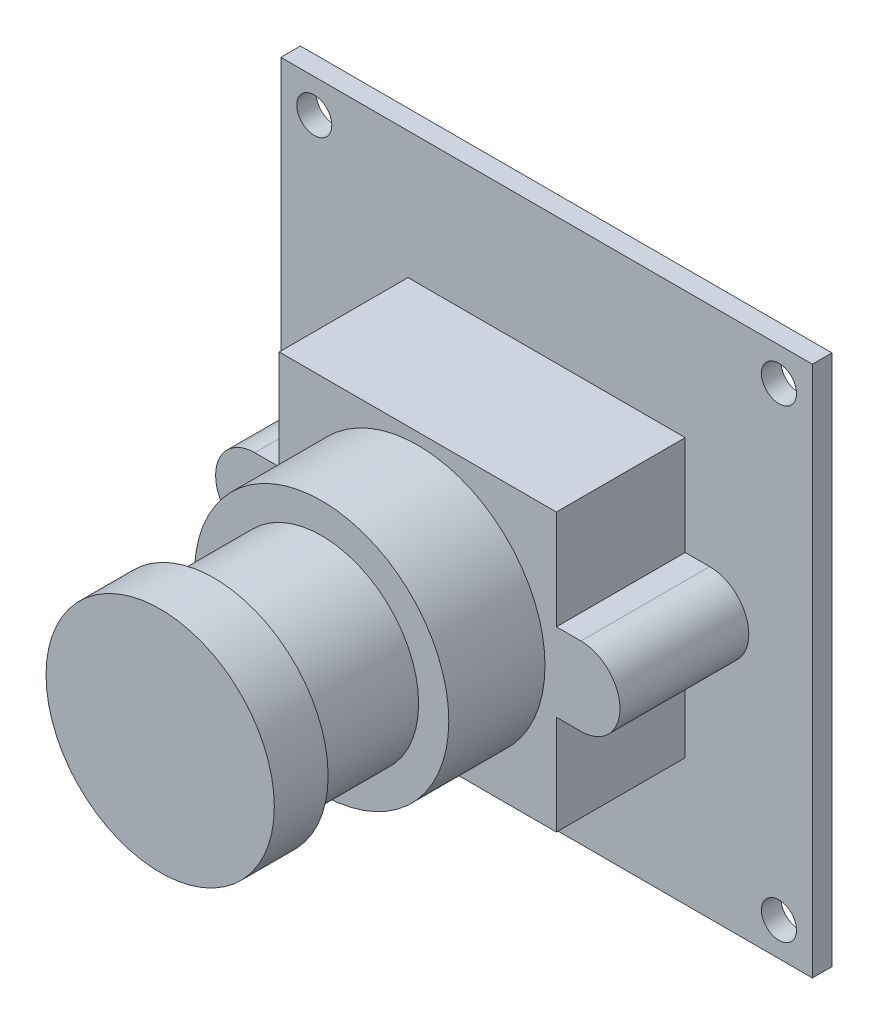
ISO-10303-21;
HEADER;
FILE_DESCRIPTION(('STEP AP214'),'2;1');
FILE_NAME('part.step','',(''),(''),'','','');
FILE_SCHEMA(('AUTOMOTIVE_DESIGN { 1 0 10303 214 1 1 1 1 }'));
ENDSEC;
DATA;
#1=APPLICATION_CONTEXT('core data for automotive mechanical design processes');
#2=APPLICATION_PROTOCOL_DEFINITION('international standard','automotive_design',2000,#1);
#3=PRODUCT_CONTEXT('',#1,'mechanical');
#4=PRODUCT('Part','Part','',(#3));
#5=PRODUCT_RELATED_PRODUCT_CATEGORY('part','',(#4));
#6=PRODUCT_DEFINITION_FORMATION('','',#4);
#7=PRODUCT_DEFINITION_CONTEXT('part definition',#1,'design');
#8=PRODUCT_DEFINITION('design','',#6,#7);
#9=PRODUCT_DEFINITION_SHAPE('','',#8);
#10=(LENGTH_UNIT() NAMED_UNIT(*) SI_UNIT(.MILLI.,.METRE.));
#11=(NAMED_UNIT(*) PLANE_ANGLE_UNIT() SI_UNIT($,.RADIAN.));
#12=(NAMED_UNIT(*) SI_UNIT($,.STERADIAN.) SOLID_ANGLE_UNIT());
#13=UNCERTAINTY_MEASURE_WITH_UNIT(LENGTH_MEASURE(1.E-05),#10,'distance_accuracy_value','');
#14=(GEOMETRIC_REPRESENTATION_CONTEXT(3) GLOBAL_UNCERTAINTY_ASSIGNED_CONTEXT((#13)) GLOBAL_UNIT_ASSIGNED_CONTEXT((#10,
#11,#12)) REPRESENTATION_CONTEXT('',''));
#15=CARTESIAN_POINT('',(0.,0.,0.));
#16=DIRECTION('',(0.,0.,1.));
#17=DIRECTION('',(1.,0.,0.));
#18=AXIS2_PLACEMENT_3D('',#15,#16,#17);
#19=CARTESIAN_POINT('',(0.,0.,15.));
#20=DIRECTION('',(0.,0.,1.));
#21=DIRECTION('',(1.,0.,0.));
#22=AXIS2_PLACEMENT_3D('',#19,#20,#21);
#23=PLANE('',#22);
#24=CARTESIAN_POINT('',(0.,0.,15.));
#25=DIRECTION('',(0.,0.,1.));
#26=DIRECTION('',(1.,0.,0.));
#27=AXIS2_PLACEMENT_3D('',#24,#25,#26);
#28=CIRCLE('',#27,7.8);
#29=CARTESIAN_POINT('',(7.8,0.,15.));
#30=VERTEX_POINT('',#29);
#31=EDGE_CURVE('E187',#30,#30,#28,.T.);
#32=ORIENTED_EDGE('',*,*,#31,.T.);
#33=EDGE_LOOP('',(#32));
#34=FACE_BOUND('',#33,.T.);
#35=CARTESIAN_POINT('',(0.,0.,15.));
#36=DIRECTION('',(0.,0.,1.));
#37=DIRECTION('',(1.,0.,0.));
#38=AXIS2_PLACEMENT_3D('',#35,#36,#37);
#39=CIRCLE('',#38,5.95);
#40=CARTESIAN_POINT('',(5.95,0.,15.));
#41=VERTEX_POINT('',#40);
#42=EDGE_CURVE('E605',#41,#41,#39,.T.);
#43=ORIENTED_EDGE('',*,*,#42,.F.);
#44=EDGE_LOOP('',(#43));
#45=FACE_BOUND('',#44,.T.);
#46=ADVANCED_FACE('F34',(#34,#45),#23,.T.);
#47=CARTESIAN_POINT('',(0.,0.,9.1));
#48=DIRECTION('',(0.,0.,1.));
#49=DIRECTION('',(1.,0.,0.));
#50=AXIS2_PLACEMENT_3D('',#47,#48,#49);
#51=PLANE('',#50);
#52=DIRECTION('',(0.,-1.,0.));
#53=VECTOR('',#52,1.);
#54=CARTESIAN_POINT('',(-8.5,8.5,9.1));
#55=LINE('',#54,#53);
#56=CARTESIAN_POINT('',(-8.5,8.5,9.1));
#57=VERTEX_POINT('',#56);
#58=CARTESIAN_POINT('',(-8.5,2.4,9.1));
#59=VERTEX_POINT('',#58);
#60=EDGE_CURVE('E201',#57,#59,#55,.T.);
#61=ORIENTED_EDGE('',*,*,#60,.T.);
#62=DIRECTION('',(-1.,0.,0.));
#63=VECTOR('',#62,1.);
#64=CARTESIAN_POINT('',(-10.,2.4,9.1));
#65=LINE('',#64,#63);
#66=CARTESIAN_POINT('',(-10.,2.4,9.1));
#67=VERTEX_POINT('',#66);
#68=EDGE_CURVE('E163',#59,#67,#65,.T.);
#69=ORIENTED_EDGE('',*,*,#68,.T.);
#70=CARTESIAN_POINT('',(-10.,0.,9.1));
#71=DIRECTION('',(0.,0.,1.));
#72=DIRECTION('',(1.,0.,0.));
#73=AXIS2_PLACEMENT_3D('',#70,#71,#72);
#74=CIRCLE('',#73,2.4);
#75=CARTESIAN_POINT('',(-10.,-2.4,9.1));
#76=VERTEX_POINT('',#75);
#77=EDGE_CURVE('E162',#67,#76,#74,.T.);
#78=ORIENTED_EDGE('',*,*,#77,.T.);
#79=DIRECTION('',(1.,0.,0.));
#80=VECTOR('',#79,1.);
#81=CARTESIAN_POINT('',(-10.,-2.4,9.1));
#82=LINE('',#81,#80);
#83=CARTESIAN_POINT('',(-8.5,-2.4,9.1));
#84=VERTEX_POINT('',#83);
#85=EDGE_CURVE('E49',#76,#84,#82,.T.);
#86=ORIENTED_EDGE('',*,*,#85,.T.);
#87=CARTESIAN_POINT('',(-8.5,-8.5,9.1));
#88=VERTEX_POINT('',#87);
#89=EDGE_CURVE('E200',#84,#88,#55,.T.);
#90=ORIENTED_EDGE('',*,*,#89,.T.);
#91=DIRECTION('',(1.,0.,0.));
#92=VECTOR('',#91,1.);
#93=CARTESIAN_POINT('',(-8.5,-8.5,9.1));
#94=LINE('',#93,#92);
#95=CARTESIAN_POINT('',(8.5,-8.5,9.1));
#96=VERTEX_POINT('',#95);
#97=EDGE_CURVE('E203',#88,#96,#94,.T.);
#98=ORIENTED_EDGE('',*,*,#97,.T.);
#99=DIRECTION('',(0.,1.,0.));
#100=VECTOR('',#99,1.);
#101=CARTESIAN_POINT('',(8.5,8.5,9.1));
#102=LINE('',#101,#100);
#103=CARTESIAN_POINT('',(8.5,-2.39999999999999,9.1));
#104=VERTEX_POINT('',#103);
#105=EDGE_CURVE('E195',#96,#104,#102,.T.);
#106=ORIENTED_EDGE('',*,*,#105,.T.);
#107=CARTESIAN_POINT('',(10.,-2.39999999999999,9.1));
#108=VERTEX_POINT('',#107);
#109=EDGE_CURVE('E169',#104,#108,#82,.T.);
#110=ORIENTED_EDGE('',*,*,#109,.T.);
#111=CARTESIAN_POINT('',(10.,0.,9.1));
#112=DIRECTION('',(0.,0.,1.));
#113=DIRECTION('',(1.,0.,0.));
#114=AXIS2_PLACEMENT_3D('',#111,#112,#113);
#115=CIRCLE('',#114,2.4);
#116=CARTESIAN_POINT('',(10.,2.40000000000001,9.1));
#117=VERTEX_POINT('',#116);
#118=EDGE_CURVE('E150',#108,#117,#115,.T.);
#119=ORIENTED_EDGE('',*,*,#118,.T.);
#120=CARTESIAN_POINT('',(8.5,2.40000000000001,9.1));
#121=VERTEX_POINT('',#120);
#122=EDGE_CURVE('E56',#117,#121,#65,.T.);
#123=ORIENTED_EDGE('',*,*,#122,.T.);
#124=CARTESIAN_POINT('',(8.5,8.5,9.1));
#125=VERTEX_POINT('',#124);
#126=EDGE_CURVE('E198',#121,#125,#102,.T.);
#127=ORIENTED_EDGE('',*,*,#126,.T.);
#128=DIRECTION('',(-1.,0.,0.));
#129=VECTOR('',#128,1.);
#130=CARTESIAN_POINT('',(-8.5,8.5,9.1));
#131=LINE('',#130,#129);
#132=EDGE_CURVE('E197',#125,#57,#131,.T.);
#133=ORIENTED_EDGE('',*,*,#132,.T.);
#134=EDGE_LOOP('',(#61,#69,#78,#86,#90,#98,#106,#110,#119,#123,#127,#133));
#135=FACE_BOUND('',#134,.T.);
#136=CARTESIAN_POINT('',(0.,0.,9.1));
#137=DIRECTION('',(0.,0.,1.));
#138=DIRECTION('',(1.,0.,0.));
#139=AXIS2_PLACEMENT_3D('',#136,#137,#138);
#140=CIRCLE('',#139,7.8);
#141=CARTESIAN_POINT('',(7.8,0.,9.1));
#142=VERTEX_POINT('',#141);
#143=EDGE_CURVE('E588',#142,#142,#140,.T.);
#144=ORIENTED_EDGE('',*,*,#143,.F.);
#145=EDGE_LOOP('',(#144));
#146=FACE_BOUND('',#145,.T.);
#147=ADVANCED_FACE('F166',(#135,#146),#51,.T.);
#148=CARTESIAN_POINT('',(0.,0.,1.2));
#149=DIRECTION('',(0.,0.,1.));
#150=DIRECTION('',(1.,0.,0.));
#151=AXIS2_PLACEMENT_3D('',#148,#149,#150);
#152=PLANE('',#151);
#153=DIRECTION('',(0.,1.,0.));
#154=VECTOR('',#153,1.);
#155=CARTESIAN_POINT('',(16.3,16.3,1.2));
#156=LINE('',#155,#154);
#157=CARTESIAN_POINT('',(16.3,-16.3,1.2));
#158=VERTEX_POINT('',#157);
#159=CARTESIAN_POINT('',(16.3,16.3,1.2));
#160=VERTEX_POINT('',#159);
#161=EDGE_CURVE('E253',#158,#160,#156,.T.);
#162=ORIENTED_EDGE('',*,*,#161,.T.);
#163=DIRECTION('',(-1.,0.,0.));
#164=VECTOR('',#163,1.);
#165=CARTESIAN_POINT('',(-16.3,16.3,1.2));
#166=LINE('',#165,#164);
#167=CARTESIAN_POINT('',(-16.3,16.3,1.2));
#168=VERTEX_POINT('',#167);
#169=EDGE_CURVE('E256',#160,#168,#166,.T.);
#170=ORIENTED_EDGE('',*,*,#169,.T.);
#171=DIRECTION('',(0.,-1.,0.));
#172=VECTOR('',#171,1.);
#173=CARTESIAN_POINT('',(-16.3,16.3,1.2));
#174=LINE('',#173,#172);
#175=CARTESIAN_POINT('',(-16.3,-16.3,1.2));
#176=VERTEX_POINT('',#175);
#177=EDGE_CURVE('E259',#168,#176,#174,.T.);
#178=ORIENTED_EDGE('',*,*,#177,.T.);
#179=DIRECTION('',(1.,0.,0.));
#180=VECTOR('',#179,1.);
#181=CARTESIAN_POINT('',(-16.3,-16.3,1.2));
#182=LINE('',#181,#180);
#183=EDGE_CURVE('E261',#176,#158,#182,.T.);
#184=ORIENTED_EDGE('',*,*,#183,.T.);
#185=EDGE_LOOP('',(#162,#170,#178,#184));
#186=FACE_BOUND('',#185,.T.);
#187=CARTESIAN_POINT('',(-14.25,14.25,1.2));
#188=DIRECTION('',(0.,0.,1.));
#189=DIRECTION('',(1.,0.,0.));
#190=AXIS2_PLACEMENT_3D('',#187,#188,#189);
#191=CIRCLE('',#190,1.075);
#192=CARTESIAN_POINT('',(-13.175,14.25,1.2));
#193=VERTEX_POINT('',#192);
#194=EDGE_CURVE('E244',#193,#193,#191,.T.);
#195=ORIENTED_EDGE('',*,*,#194,.F.);
#196=EDGE_LOOP('',(#195));
#197=FACE_BOUND('',#196,.T.);
#198=CARTESIAN_POINT('',(14.25,14.25,1.2));
#199=DIRECTION('',(0.,0.,1.));
#200=DIRECTION('',(1.,0.,0.));
#201=AXIS2_PLACEMENT_3D('',#198,#199,#200);
#202=CIRCLE('',#201,1.075);
#203=CARTESIAN_POINT('',(15.325,14.25,1.2));
#204=VERTEX_POINT('',#203);
#205=EDGE_CURVE('E238',#204,#204,#202,.T.);
#206=ORIENTED_EDGE('',*,*,#205,.F.);
#207=EDGE_LOOP('',(#206));
#208=FACE_BOUND('',#207,.T.);
#209=CARTESIAN_POINT('',(14.25,-14.25,1.2));
#210=DIRECTION('',(0.,0.,1.));
#211=DIRECTION('',(1.,0.,0.));
#212=AXIS2_PLACEMENT_3D('',#209,#210,#211);
#213=CIRCLE('',#212,1.075);
#214=CARTESIAN_POINT('',(15.325,-14.25,1.2));
#215=VERTEX_POINT('',#214);
#216=EDGE_CURVE('E232',#215,#215,#213,.T.);
#217=ORIENTED_EDGE('',*,*,#216,.F.);
#218=EDGE_LOOP('',(#217));
#219=FACE_BOUND('',#218,.T.);
#220=CARTESIAN_POINT('',(-14.25,-14.25,1.2));
#221=DIRECTION('',(0.,0.,1.));
#222=DIRECTION('',(1.,0.,0.));
#223=AXIS2_PLACEMENT_3D('',#220,#221,#222);
#224=CIRCLE('',#223,1.075);
#225=CARTESIAN_POINT('',(-13.175,-14.25,1.2));
#226=VERTEX_POINT('',#225);
#227=EDGE_CURVE('E228',#226,#226,#224,.T.);
#228=ORIENTED_EDGE('',*,*,#227,.F.);
#229=EDGE_LOOP('',(#228));
#230=FACE_BOUND('',#229,.T.);
#231=DIRECTION('',(0.,-1.,0.));
#232=VECTOR('',#231,1.);
#233=CARTESIAN_POINT('',(-8.5,8.5,1.2));
#234=LINE('',#233,#232);
#235=CARTESIAN_POINT('',(-8.5,-2.4,1.2));
#236=VERTEX_POINT('',#235);
#237=CARTESIAN_POINT('',(-8.5,-8.5,1.2));
#238=VERTEX_POINT('',#237);
#239=EDGE_CURVE('E211',#236,#238,#234,.T.);
#240=ORIENTED_EDGE('',*,*,#239,.F.);
#241=DIRECTION('',(1.,0.,0.));
#242=VECTOR('',#241,1.);
#243=CARTESIAN_POINT('',(-10.,-2.4,1.2));
#244=LINE('',#243,#242);
#245=CARTESIAN_POINT('',(-10.,-2.4,1.2));
#246=VERTEX_POINT('',#245);
#247=EDGE_CURVE('E183',#246,#236,#244,.T.);
#248=ORIENTED_EDGE('',*,*,#247,.F.);
#249=CARTESIAN_POINT('',(-10.,0.,1.2));
#250=DIRECTION('',(0.,0.,1.));
#251=DIRECTION('',(1.,0.,0.));
#252=AXIS2_PLACEMENT_3D('',#249,#250,#251);
#253=CIRCLE('',#252,2.4);
#254=CARTESIAN_POINT('',(-10.,2.4,1.2));
#255=VERTEX_POINT('',#254);
#256=EDGE_CURVE('E175',#255,#246,#253,.T.);
#257=ORIENTED_EDGE('',*,*,#256,.F.);
#258=DIRECTION('',(-1.,0.,0.));
#259=VECTOR('',#258,1.);
#260=CARTESIAN_POINT('',(-10.,2.4,1.2));
#261=LINE('',#260,#259);
#262=CARTESIAN_POINT('',(-8.5,2.4,1.2));
#263=VERTEX_POINT('',#262);
#264=EDGE_CURVE('E156',#263,#255,#261,.T.);
#265=ORIENTED_EDGE('',*,*,#264,.F.);
#266=CARTESIAN_POINT('',(-8.5,8.5,1.2));
#267=VERTEX_POINT('',#266);
#268=EDGE_CURVE('E212',#267,#263,#234,.T.);
#269=ORIENTED_EDGE('',*,*,#268,.F.);
#270=DIRECTION('',(-1.,0.,0.));
#271=VECTOR('',#270,1.);
#272=CARTESIAN_POINT('',(-8.5,8.5,1.2));
#273=LINE('',#272,#271);
#274=CARTESIAN_POINT('',(8.5,8.5,1.2));
#275=VERTEX_POINT('',#274);
#276=EDGE_CURVE('E209',#275,#267,#273,.T.);
#277=ORIENTED_EDGE('',*,*,#276,.F.);
#278=DIRECTION('',(0.,1.,0.));
#279=VECTOR('',#278,1.);
#280=CARTESIAN_POINT('',(8.5,8.5,1.2));
#281=LINE('',#280,#279);
#282=CARTESIAN_POINT('',(8.5,2.40000000000001,1.2));
#283=VERTEX_POINT('',#282);
#284=EDGE_CURVE('E194',#283,#275,#281,.T.);
#285=ORIENTED_EDGE('',*,*,#284,.F.);
#286=CARTESIAN_POINT('',(10.,2.40000000000001,1.2));
#287=VERTEX_POINT('',#286);
#288=EDGE_CURVE('E584',#287,#283,#261,.T.);
#289=ORIENTED_EDGE('',*,*,#288,.F.);
#290=CARTESIAN_POINT('',(10.,0.,1.2));
#291=DIRECTION('',(0.,0.,1.));
#292=DIRECTION('',(1.,0.,0.));
#293=AXIS2_PLACEMENT_3D('',#290,#291,#292);
#294=CIRCLE('',#293,2.4);
#295=CARTESIAN_POINT('',(10.,-2.39999999999999,1.2));
#296=VERTEX_POINT('',#295);
#297=EDGE_CURVE('E153',#296,#287,#294,.T.);
#298=ORIENTED_EDGE('',*,*,#297,.F.);
#299=CARTESIAN_POINT('',(8.5,-2.39999999999999,1.2));
#300=VERTEX_POINT('',#299);
#301=EDGE_CURVE('E181',#300,#296,#244,.T.);
#302=ORIENTED_EDGE('',*,*,#301,.F.);
#303=CARTESIAN_POINT('',(8.5,-8.5,1.2));
#304=VERTEX_POINT('',#303);
#305=EDGE_CURVE('E206',#304,#300,#281,.T.);
#306=ORIENTED_EDGE('',*,*,#305,.F.);
#307=DIRECTION('',(1.,0.,0.));
#308=VECTOR('',#307,1.);
#309=CARTESIAN_POINT('',(-8.5,-8.5,1.2));
#310=LINE('',#309,#308);
#311=EDGE_CURVE('E215',#238,#304,#310,.T.);
#312=ORIENTED_EDGE('',*,*,#311,.F.);
#313=EDGE_LOOP('',(#240,#248,#257,#265,#269,#277,#285,#289,#298,#302,#306,#312));
#314=FACE_BOUND('',#313,.T.);
#315=ADVANCED_FACE('F295',(#186,#197,#208,#219,#230,#314),#152,.T.);
#316=CARTESIAN_POINT('',(8.5,8.5,9.1));
#317=DIRECTION('',(-1.,0.,0.));
#318=DIRECTION('',(0.,-1.,0.));
#319=AXIS2_PLACEMENT_3D('',#316,#317,#318);
#320=PLANE('',#319);
#321=DIRECTION('',(0.,0.,-1.));
#322=VECTOR('',#321,1.);
#323=CARTESIAN_POINT('',(8.5,-2.39999999999999,9.1));
#324=LINE('',#323,#322);
#325=EDGE_CURVE('E192',#104,#300,#324,.T.);
#326=ORIENTED_EDGE('',*,*,#325,.F.);
#327=ORIENTED_EDGE('',*,*,#105,.F.);
#328=DIRECTION('',(0.,0.,-1.));
#329=VECTOR('',#328,1.);
#330=CARTESIAN_POINT('',(8.5,-8.5,9.1));
#331=LINE('',#330,#329);
#332=EDGE_CURVE('E205',#96,#304,#331,.T.);
#333=ORIENTED_EDGE('',*,*,#332,.T.);
#334=ORIENTED_EDGE('',*,*,#305,.T.);
#335=EDGE_LOOP('',(#326,#327,#333,#334));
#336=FACE_BOUND('',#335,.T.);
#337=ADVANCED_FACE('F350',(#336),#320,.F.);
#338=DIRECTION('',(0.,0.,1.));
#339=VECTOR('',#338,1.);
#340=CARTESIAN_POINT('',(8.5,2.40000000000001,9.1));
#341=LINE('',#340,#339);
#342=EDGE_CURVE('E160',#283,#121,#341,.T.);
#343=ORIENTED_EDGE('',*,*,#342,.F.);
#344=ORIENTED_EDGE('',*,*,#284,.T.);
#345=DIRECTION('',(0.,0.,-1.));
#346=VECTOR('',#345,1.);
#347=CARTESIAN_POINT('',(8.5,8.5,9.1));
#348=LINE('',#347,#346);
#349=EDGE_CURVE('E225',#125,#275,#348,.T.);
#350=ORIENTED_EDGE('',*,*,#349,.F.);
#351=ORIENTED_EDGE('',*,*,#126,.F.);
#352=EDGE_LOOP('',(#343,#344,#350,#351));
#353=FACE_BOUND('',#352,.T.);
#354=ADVANCED_FACE('F344',(#353),#320,.F.);
#355=CARTESIAN_POINT('',(-8.5,8.5,9.1));
#356=DIRECTION('',(1.,0.,0.));
#357=DIRECTION('',(0.,1.,0.));
#358=AXIS2_PLACEMENT_3D('',#355,#356,#357);
#359=PLANE('',#358);
#360=DIRECTION('',(0.,0.,1.));
#361=VECTOR('',#360,1.);
#362=CARTESIAN_POINT('',(-8.5,-2.4,9.1));
#363=LINE('',#362,#361);
#364=EDGE_CURVE('E190',#236,#84,#363,.T.);
#365=ORIENTED_EDGE('',*,*,#364,.F.);
#366=ORIENTED_EDGE('',*,*,#239,.T.);
#367=DIRECTION('',(0.,0.,-1.));
#368=VECTOR('',#367,1.);
#369=CARTESIAN_POINT('',(-8.5,-8.5,9.1));
#370=LINE('',#369,#368);
#371=EDGE_CURVE('E219',#88,#238,#370,.T.);
#372=ORIENTED_EDGE('',*,*,#371,.F.);
#373=ORIENTED_EDGE('',*,*,#89,.F.);
#374=EDGE_LOOP('',(#365,#366,#372,#373));
#375=FACE_BOUND('',#374,.T.);
#376=ADVANCED_FACE('F341',(#375),#359,.F.);
#377=DIRECTION('',(0.,0.,-1.));
#378=VECTOR('',#377,1.);
#379=CARTESIAN_POINT('',(-8.5,2.4,9.1));
#380=LINE('',#379,#378);
#381=EDGE_CURVE('E170',#59,#263,#380,.T.);
#382=ORIENTED_EDGE('',*,*,#381,.F.);
#383=ORIENTED_EDGE('',*,*,#60,.F.);
#384=DIRECTION('',(0.,0.,-1.));
#385=VECTOR('',#384,1.);
#386=CARTESIAN_POINT('',(-8.5,8.5,9.1));
#387=LINE('',#386,#385);
#388=EDGE_CURVE('E222',#57,#267,#387,.T.);
#389=ORIENTED_EDGE('',*,*,#388,.T.);
#390=ORIENTED_EDGE('',*,*,#268,.T.);
#391=EDGE_LOOP('',(#382,#383,#389,#390));
#392=FACE_BOUND('',#391,.T.);
#393=ADVANCED_FACE('F304',(#392),#359,.F.);
#394=CARTESIAN_POINT('',(16.3,16.3,1.2));
#395=DIRECTION('',(-1.,0.,0.));
#396=DIRECTION('',(0.,-1.,0.));
#397=AXIS2_PLACEMENT_3D('',#394,#395,#396);
#398=PLANE('',#397);
#399=DIRECTION('',(0.,1.,0.));
#400=VECTOR('',#399,1.);
#401=CARTESIAN_POINT('',(16.3,16.3,0.));
#402=LINE('',#401,#400);
#403=CARTESIAN_POINT('',(16.3,-16.3,0.));
#404=VERTEX_POINT('',#403);
#405=CARTESIAN_POINT('',(16.3,16.3,0.));
#406=VERTEX_POINT('',#405);
#407=EDGE_CURVE('E250',#404,#406,#402,.T.);
#408=ORIENTED_EDGE('',*,*,#407,.T.);
#409=DIRECTION('',(0.,0.,-1.));
#410=VECTOR('',#409,1.);
#411=CARTESIAN_POINT('',(16.3,16.3,1.2));
#412=LINE('',#411,#410);
#413=EDGE_CURVE('E11',#160,#406,#412,.T.);
#414=ORIENTED_EDGE('',*,*,#413,.F.);
#415=ORIENTED_EDGE('',*,*,#161,.F.);
#416=DIRECTION('',(0.,0.,-1.));
#417=VECTOR('',#416,1.);
#418=CARTESIAN_POINT('',(16.3,-16.3,1.2));
#419=LINE('',#418,#417);
#420=EDGE_CURVE('E263',#158,#404,#419,.T.);
#421=ORIENTED_EDGE('',*,*,#420,.T.);
#422=EDGE_LOOP('',(#408,#414,#415,#421));
#423=FACE_BOUND('',#422,.T.);
#424=ADVANCED_FACE('F36',(#423),#398,.F.);
#425=CARTESIAN_POINT('',(-16.3,16.3,1.2));
#426=DIRECTION('',(0.,-1.,0.));
#427=DIRECTION('',(0.,0.,-1.));
#428=AXIS2_PLACEMENT_3D('',#425,#426,#427);
#429=PLANE('',#428);
#430=DIRECTION('',(-1.,0.,0.));
#431=VECTOR('',#430,1.);
#432=CARTESIAN_POINT('',(-16.3,16.3,0.));
#433=LINE('',#432,#431);
#434=CARTESIAN_POINT('',(-16.3,16.3,0.));
#435=VERTEX_POINT('',#434);
#436=EDGE_CURVE('E266',#406,#435,#433,.T.);
#437=ORIENTED_EDGE('',*,*,#436,.T.);
#438=DIRECTION('',(0.,0.,-1.));
#439=VECTOR('',#438,1.);
#440=CARTESIAN_POINT('',(-16.3,16.3,1.2));
#441=LINE('',#440,#439);
#442=EDGE_CURVE('E42',#168,#435,#441,.T.);
#443=ORIENTED_EDGE('',*,*,#442,.F.);
#444=ORIENTED_EDGE('',*,*,#169,.F.);
#445=ORIENTED_EDGE('',*,*,#413,.T.);
#446=EDGE_LOOP('',(#437,#443,#444,#445));
#447=FACE_BOUND('',#446,.T.);
#448=ADVANCED_FACE('F297',(#447),#429,.F.);
#449=CARTESIAN_POINT('',(-16.3,16.3,1.2));
#450=DIRECTION('',(1.,0.,0.));
#451=DIRECTION('',(0.,1.,0.));
#452=AXIS2_PLACEMENT_3D('',#449,#450,#451);
#453=PLANE('',#452);
#454=DIRECTION('',(0.,-1.,0.));
#455=VECTOR('',#454,1.);
#456=CARTESIAN_POINT('',(-16.3,16.3,0.));
#457=LINE('',#456,#455);
#458=CARTESIAN_POINT('',(-16.3,-16.3,0.));
#459=VERTEX_POINT('',#458);
#460=EDGE_CURVE('E268',#435,#459,#457,.T.);
#461=ORIENTED_EDGE('',*,*,#460,.T.);
#462=DIRECTION('',(0.,0.,-1.));
#463=VECTOR('',#462,1.);
#464=CARTESIAN_POINT('',(-16.3,-16.3,1.2));
#465=LINE('',#464,#463);
#466=EDGE_CURVE('E273',#176,#459,#465,.T.);
#467=ORIENTED_EDGE('',*,*,#466,.F.);
#468=ORIENTED_EDGE('',*,*,#177,.F.);
#469=ORIENTED_EDGE('',*,*,#442,.T.);
#470=EDGE_LOOP('',(#461,#467,#468,#469));
#471=FACE_BOUND('',#470,.T.);
#472=ADVANCED_FACE('F280',(#471),#453,.F.);
#473=CARTESIAN_POINT('',(-16.3,-16.3,1.2));
#474=DIRECTION('',(0.,1.,0.));
#475=DIRECTION('',(0.,0.,1.));
#476=AXIS2_PLACEMENT_3D('',#473,#474,#475);
#477=PLANE('',#476);
#478=DIRECTION('',(1.,0.,0.));
#479=VECTOR('',#478,1.);
#480=CARTESIAN_POINT('',(-16.3,-16.3,0.));
#481=LINE('',#480,#479);
#482=EDGE_CURVE('E257',#459,#404,#481,.T.);
#483=ORIENTED_EDGE('',*,*,#482,.T.);
#484=ORIENTED_EDGE('',*,*,#420,.F.);
#485=ORIENTED_EDGE('',*,*,#183,.F.);
#486=ORIENTED_EDGE('',*,*,#466,.T.);
#487=EDGE_LOOP('',(#483,#484,#485,#486));
#488=FACE_BOUND('',#487,.T.);
#489=ADVANCED_FACE('F289',(#488),#477,.F.);
#490=CARTESIAN_POINT('',(0.,0.,0.));
#491=DIRECTION('',(0.,0.,1.));
#492=DIRECTION('',(1.,0.,0.));
#493=AXIS2_PLACEMENT_3D('',#490,#491,#492);
#494=PLANE('',#493);
#495=CARTESIAN_POINT('',(-14.25,-14.25,0.));
#496=DIRECTION('',(0.,0.,1.));
#497=DIRECTION('',(1.,0.,0.));
#498=AXIS2_PLACEMENT_3D('',#495,#496,#497);
#499=CIRCLE('',#498,1.075);
#500=CARTESIAN_POINT('',(-13.175,-14.25,0.));
#501=VERTEX_POINT('',#500);
#502=EDGE_CURVE('E229',#501,#501,#499,.T.);
#503=ORIENTED_EDGE('',*,*,#502,.T.);
#504=EDGE_LOOP('',(#503));
#505=FACE_BOUND('',#504,.T.);
#506=CARTESIAN_POINT('',(14.25,-14.25,0.));
#507=DIRECTION('',(0.,0.,1.));
#508=DIRECTION('',(1.,0.,0.));
#509=AXIS2_PLACEMENT_3D('',#506,#507,#508);
#510=CIRCLE('',#509,1.075);
#511=CARTESIAN_POINT('',(15.325,-14.25,0.));
#512=VERTEX_POINT('',#511);
#513=EDGE_CURVE('E235',#512,#512,#510,.T.);
#514=ORIENTED_EDGE('',*,*,#513,.T.);
#515=EDGE_LOOP('',(#514));
#516=FACE_BOUND('',#515,.T.);
#517=CARTESIAN_POINT('',(14.25,14.25,0.));
#518=DIRECTION('',(0.,0.,1.));
#519=DIRECTION('',(1.,0.,0.));
#520=AXIS2_PLACEMENT_3D('',#517,#518,#519);
#521=CIRCLE('',#520,1.075);
#522=CARTESIAN_POINT('',(15.325,14.25,0.));
#523=VERTEX_POINT('',#522);
#524=EDGE_CURVE('E241',#523,#523,#521,.T.);
#525=ORIENTED_EDGE('',*,*,#524,.T.);
#526=EDGE_LOOP('',(#525));
#527=FACE_BOUND('',#526,.T.);
#528=CARTESIAN_POINT('',(-14.25,14.25,0.));
#529=DIRECTION('',(0.,0.,1.));
#530=DIRECTION('',(1.,0.,0.));
#531=AXIS2_PLACEMENT_3D('',#528,#529,#530);
#532=CIRCLE('',#531,1.075);
#533=CARTESIAN_POINT('',(-13.175,14.25,0.));
#534=VERTEX_POINT('',#533);
#535=EDGE_CURVE('E247',#534,#534,#532,.T.);
#536=ORIENTED_EDGE('',*,*,#535,.T.);
#537=EDGE_LOOP('',(#536));
#538=FACE_BOUND('',#537,.T.);
#539=ORIENTED_EDGE('',*,*,#407,.F.);
#540=ORIENTED_EDGE('',*,*,#482,.F.);
#541=ORIENTED_EDGE('',*,*,#460,.F.);
#542=ORIENTED_EDGE('',*,*,#436,.F.);
#543=EDGE_LOOP('',(#539,#540,#541,#542));
#544=FACE_BOUND('',#543,.T.);
#545=ADVANCED_FACE('F286',(#505,#516,#527,#538,#544),#494,.F.);
#546=CARTESIAN_POINT('',(-14.25,14.25,0.));
#547=DIRECTION('',(0.,0.,1.));
#548=DIRECTION('',(1.,0.,0.));
#549=AXIS2_PLACEMENT_3D('',#546,#547,#548);
#550=CYLINDRICAL_SURFACE('',#549,1.075);
#551=ORIENTED_EDGE('',*,*,#535,.F.);
#552=EDGE_LOOP('',(#551));
#553=FACE_BOUND('',#552,.T.);
#554=ORIENTED_EDGE('',*,*,#194,.T.);
#555=EDGE_LOOP('',(#554));
#556=FACE_BOUND('',#555,.T.);
#557=ADVANCED_FACE('F364',(#553,#556),#550,.F.);
#558=CARTESIAN_POINT('',(14.25,14.25,0.));
#559=DIRECTION('',(0.,0.,1.));
#560=DIRECTION('',(1.,0.,0.));
#561=AXIS2_PLACEMENT_3D('',#558,#559,#560);
#562=CYLINDRICAL_SURFACE('',#561,1.075);
#563=ORIENTED_EDGE('',*,*,#524,.F.);
#564=EDGE_LOOP('',(#563));
#565=FACE_BOUND('',#564,.T.);
#566=ORIENTED_EDGE('',*,*,#205,.T.);
#567=EDGE_LOOP('',(#566));
#568=FACE_BOUND('',#567,.T.);
#569=ADVANCED_FACE('F360',(#565,#568),#562,.F.);
#570=CARTESIAN_POINT('',(14.25,-14.25,0.));
#571=DIRECTION('',(0.,0.,1.));
#572=DIRECTION('',(1.,0.,0.));
#573=AXIS2_PLACEMENT_3D('',#570,#571,#572);
#574=CYLINDRICAL_SURFACE('',#573,1.075);
#575=ORIENTED_EDGE('',*,*,#513,.F.);
#576=EDGE_LOOP('',(#575));
#577=FACE_BOUND('',#576,.T.);
#578=ORIENTED_EDGE('',*,*,#216,.T.);
#579=EDGE_LOOP('',(#578));
#580=FACE_BOUND('',#579,.T.);
#581=ADVANCED_FACE('F356',(#577,#580),#574,.F.);
#582=CARTESIAN_POINT('',(-14.25,-14.25,0.));
#583=DIRECTION('',(0.,0.,1.));
#584=DIRECTION('',(1.,0.,0.));
#585=AXIS2_PLACEMENT_3D('',#582,#583,#584);
#586=CYLINDRICAL_SURFACE('',#585,1.075);
#587=ORIENTED_EDGE('',*,*,#502,.F.);
#588=EDGE_LOOP('',(#587));
#589=FACE_BOUND('',#588,.T.);
#590=ORIENTED_EDGE('',*,*,#227,.T.);
#591=EDGE_LOOP('',(#590));
#592=FACE_BOUND('',#591,.T.);
#593=ADVANCED_FACE('F348',(#589,#592),#586,.F.);
#594=CARTESIAN_POINT('',(-8.5,8.5,9.1));
#595=DIRECTION('',(0.,-1.,0.));
#596=DIRECTION('',(1.,0.,0.));
#597=AXIS2_PLACEMENT_3D('',#594,#595,#596);
#598=PLANE('',#597);
#599=ORIENTED_EDGE('',*,*,#276,.T.);
#600=ORIENTED_EDGE('',*,*,#388,.F.);
#601=ORIENTED_EDGE('',*,*,#132,.F.);
#602=ORIENTED_EDGE('',*,*,#349,.T.);
#603=EDGE_LOOP('',(#599,#600,#601,#602));
#604=FACE_BOUND('',#603,.T.);
#605=ADVANCED_FACE('F339',(#604),#598,.F.);
#606=CARTESIAN_POINT('',(-8.5,-8.5,9.1));
#607=DIRECTION('',(0.,1.,0.));
#608=DIRECTION('',(0.,0.,1.));
#609=AXIS2_PLACEMENT_3D('',#606,#607,#608);
#610=PLANE('',#609);
#611=ORIENTED_EDGE('',*,*,#311,.T.);
#612=ORIENTED_EDGE('',*,*,#332,.F.);
#613=ORIENTED_EDGE('',*,*,#97,.F.);
#614=ORIENTED_EDGE('',*,*,#371,.T.);
#615=EDGE_LOOP('',(#611,#612,#613,#614));
#616=FACE_BOUND('',#615,.T.);
#617=ADVANCED_FACE('F336',(#616),#610,.F.);
#618=CARTESIAN_POINT('',(-10.,2.4,34.3602454461551));
#619=DIRECTION('',(0.,-1.,0.));
#620=DIRECTION('',(1.,0.,0.));
#621=AXIS2_PLACEMENT_3D('',#618,#619,#620);
#622=PLANE('',#621);
#623=ORIENTED_EDGE('',*,*,#68,.F.);
#624=ORIENTED_EDGE('',*,*,#381,.T.);
#625=ORIENTED_EDGE('',*,*,#264,.T.);
#626=DIRECTION('',(0.,0.,-1.));
#627=VECTOR('',#626,1.);
#628=CARTESIAN_POINT('',(-10.,2.4,34.3602454461551));
#629=LINE('',#628,#627);
#630=EDGE_CURVE('E185',#67,#255,#629,.T.);
#631=ORIENTED_EDGE('',*,*,#630,.F.);
#632=EDGE_LOOP('',(#623,#624,#625,#631));
#633=FACE_BOUND('',#632,.T.);
#634=ADVANCED_FACE('F325',(#633),#622,.F.);
#635=CARTESIAN_POINT('',(-10.,-2.4,34.3602454461551));
#636=DIRECTION('',(0.,1.,0.));
#637=DIRECTION('',(-1.,0.,0.));
#638=AXIS2_PLACEMENT_3D('',#635,#636,#637);
#639=PLANE('',#638);
#640=ORIENTED_EDGE('',*,*,#247,.T.);
#641=ORIENTED_EDGE('',*,*,#364,.T.);
#642=ORIENTED_EDGE('',*,*,#85,.F.);
#643=DIRECTION('',(0.,0.,-1.));
#644=VECTOR('',#643,1.);
#645=CARTESIAN_POINT('',(-10.,-2.4,34.3602454461551));
#646=LINE('',#645,#644);
#647=EDGE_CURVE('E179',#76,#246,#646,.T.);
#648=ORIENTED_EDGE('',*,*,#647,.T.);
#649=EDGE_LOOP('',(#640,#641,#642,#648));
#650=FACE_BOUND('',#649,.T.);
#651=ADVANCED_FACE('F332',(#650),#639,.F.);
#652=CARTESIAN_POINT('',(-10.,0.,34.3602454461551));
#653=DIRECTION('',(0.,0.,-1.));
#654=DIRECTION('',(-1.,0.,0.));
#655=AXIS2_PLACEMENT_3D('',#652,#653,#654);
#656=CYLINDRICAL_SURFACE('',#655,2.4);
#657=ORIENTED_EDGE('',*,*,#77,.F.);
#658=ORIENTED_EDGE('',*,*,#630,.T.);
#659=ORIENTED_EDGE('',*,*,#256,.T.);
#660=ORIENTED_EDGE('',*,*,#647,.F.);
#661=EDGE_LOOP('',(#657,#658,#659,#660));
#662=FACE_BOUND('',#661,.T.);
#663=ADVANCED_FACE('F330',(#662),#656,.T.);
#664=ORIENTED_EDGE('',*,*,#109,.F.);
#665=ORIENTED_EDGE('',*,*,#325,.T.);
#666=ORIENTED_EDGE('',*,*,#301,.T.);
#667=DIRECTION('',(0.,0.,-1.));
#668=VECTOR('',#667,1.);
#669=CARTESIAN_POINT('',(10.,-2.39999999999999,34.3602454461551));
#670=LINE('',#669,#668);
#671=EDGE_CURVE('E182',#108,#296,#670,.T.);
#672=ORIENTED_EDGE('',*,*,#671,.F.);
#673=EDGE_LOOP('',(#664,#665,#666,#672));
#674=FACE_BOUND('',#673,.T.);
#675=ADVANCED_FACE('F324',(#674),#639,.F.);
#676=ORIENTED_EDGE('',*,*,#288,.T.);
#677=ORIENTED_EDGE('',*,*,#342,.T.);
#678=ORIENTED_EDGE('',*,*,#122,.F.);
#679=DIRECTION('',(0.,0.,-1.));
#680=VECTOR('',#679,1.);
#681=CARTESIAN_POINT('',(10.,2.40000000000001,34.3602454461551));
#682=LINE('',#681,#680);
#683=EDGE_CURVE('E147',#117,#287,#682,.T.);
#684=ORIENTED_EDGE('',*,*,#683,.T.);
#685=EDGE_LOOP('',(#676,#677,#678,#684));
#686=FACE_BOUND('',#685,.T.);
#687=ADVANCED_FACE('F158',(#686),#622,.F.);
#688=CARTESIAN_POINT('',(10.,0.,34.3602454461551));
#689=DIRECTION('',(0.,0.,-1.));
#690=DIRECTION('',(-1.,0.,0.));
#691=AXIS2_PLACEMENT_3D('',#688,#689,#690);
#692=CYLINDRICAL_SURFACE('',#691,2.4);
#693=ORIENTED_EDGE('',*,*,#118,.F.);
#694=ORIENTED_EDGE('',*,*,#671,.T.);
#695=ORIENTED_EDGE('',*,*,#297,.T.);
#696=ORIENTED_EDGE('',*,*,#683,.F.);
#697=EDGE_LOOP('',(#693,#694,#695,#696));
#698=FACE_BOUND('',#697,.T.);
#699=ADVANCED_FACE('F148',(#698),#692,.T.);
#700=CARTESIAN_POINT('',(0.,0.,15.));
#701=DIRECTION('',(0.,0.,-1.));
#702=DIRECTION('',(-1.,0.,0.));
#703=AXIS2_PLACEMENT_3D('',#700,#701,#702);
#704=CYLINDRICAL_SURFACE('',#703,7.8);
#705=ORIENTED_EDGE('',*,*,#31,.F.);
#706=EDGE_LOOP('',(#705));
#707=FACE_BOUND('',#706,.T.);
#708=ORIENTED_EDGE('',*,*,#143,.T.);
#709=EDGE_LOOP('',(#708));
#710=FACE_BOUND('',#709,.T.);
#711=ADVANCED_FACE('F318',(#707,#710),#704,.T.);
#712=CARTESIAN_POINT('',(0.,0.,21.6));
#713=DIRECTION('',(0.,0.,-1.));
#714=DIRECTION('',(-1.,0.,0.));
#715=AXIS2_PLACEMENT_3D('',#712,#713,#714);
#716=CYLINDRICAL_SURFACE('',#715,5.95);
#717=CARTESIAN_POINT('',(0.,0.,21.6));
#718=DIRECTION('',(0.,0.,1.));
#719=DIRECTION('',(1.,0.,0.));
#720=AXIS2_PLACEMENT_3D('',#717,#718,#719);
#721=CIRCLE('',#720,5.95);
#722=CARTESIAN_POINT('',(5.95,0.,21.6));
#723=VERTEX_POINT('',#722);
#724=EDGE_CURVE('E603',#723,#723,#721,.T.);
#725=ORIENTED_EDGE('',*,*,#724,.F.);
#726=EDGE_LOOP('',(#725));
#727=FACE_BOUND('',#726,.T.);
#728=ORIENTED_EDGE('',*,*,#42,.T.);
#729=EDGE_LOOP('',(#728));
#730=FACE_BOUND('',#729,.T.);
#731=ADVANCED_FACE('F316',(#727,#730),#716,.T.);
#732=CARTESIAN_POINT('',(0.,0.,21.6));
#733=DIRECTION('',(0.,0.,1.));
#734=DIRECTION('',(1.,0.,0.));
#735=AXIS2_PLACEMENT_3D('',#732,#733,#734);
#736=PLANE('',#735);
#737=CARTESIAN_POINT('',(0.,0.,21.6));
#738=DIRECTION('',(0.,0.,1.));
#739=DIRECTION('',(1.,0.,0.));
#740=AXIS2_PLACEMENT_3D('',#737,#738,#739);
#741=CIRCLE('',#740,7.);
#742=CARTESIAN_POINT('',(7.,0.,21.6));
#743=VERTEX_POINT('',#742);
#744=EDGE_CURVE('E611',#743,#743,#741,.T.);
#745=ORIENTED_EDGE('',*,*,#744,.F.);
#746=EDGE_LOOP('',(#745));
#747=FACE_BOUND('',#746,.T.);
#748=ORIENTED_EDGE('',*,*,#724,.T.);
#749=EDGE_LOOP('',(#748));
#750=FACE_BOUND('',#749,.T.);
#751=ADVANCED_FACE('F448',(#747,#750),#736,.F.);
#752=CARTESIAN_POINT('',(0.,0.,24.9));
#753=DIRECTION('',(0.,0.,-1.));
#754=DIRECTION('',(-1.,0.,0.));
#755=AXIS2_PLACEMENT_3D('',#752,#753,#754);
#756=CYLINDRICAL_SURFACE('',#755,7.);
#757=CARTESIAN_POINT('',(0.,0.,24.9));
#758=DIRECTION('',(0.,0.,1.));
#759=DIRECTION('',(1.,0.,0.));
#760=AXIS2_PLACEMENT_3D('',#757,#758,#759);
#761=CIRCLE('',#760,7.);
#762=CARTESIAN_POINT('',(7.,0.,24.9));
#763=VERTEX_POINT('',#762);
#764=EDGE_CURVE('E608',#763,#763,#761,.T.);
#765=ORIENTED_EDGE('',*,*,#764,.F.);
#766=EDGE_LOOP('',(#765));
#767=FACE_BOUND('',#766,.T.);
#768=ORIENTED_EDGE('',*,*,#744,.T.);
#769=EDGE_LOOP('',(#768));
#770=FACE_BOUND('',#769,.T.);
#771=ADVANCED_FACE('F455',(#767,#770),#756,.T.);
#772=CARTESIAN_POINT('',(0.,0.,24.9));
#773=DIRECTION('',(0.,0.,1.));
#774=DIRECTION('',(1.,0.,0.));
#775=AXIS2_PLACEMENT_3D('',#772,#773,#774);
#776=PLANE('',#775);
#777=ORIENTED_EDGE('',*,*,#764,.T.);
#778=EDGE_LOOP('',(#777));
#779=FACE_BOUND('',#778,.T.);
#780=ADVANCED_FACE('F463',(#779),#776,.T.);
#781=CLOSED_SHELL('',(#46,#147,#315,#337,#354,#376,#393,#424,#448,#472,#489,#545,#557,#569,#581,
#593,#605,#617,#634,#651,#663,#675,#687,#699,#711,#731,#751,#771,#780));
#782=MANIFOLD_SOLID_BREP('B2',#781);
#783=ADVANCED_BREP_SHAPE_REPRESENTATION('',(#18,#782),#14);
#784=SHAPE_DEFINITION_REPRESENTATION(#9,#783);
ENDSEC;
END-ISO-10303-21;
